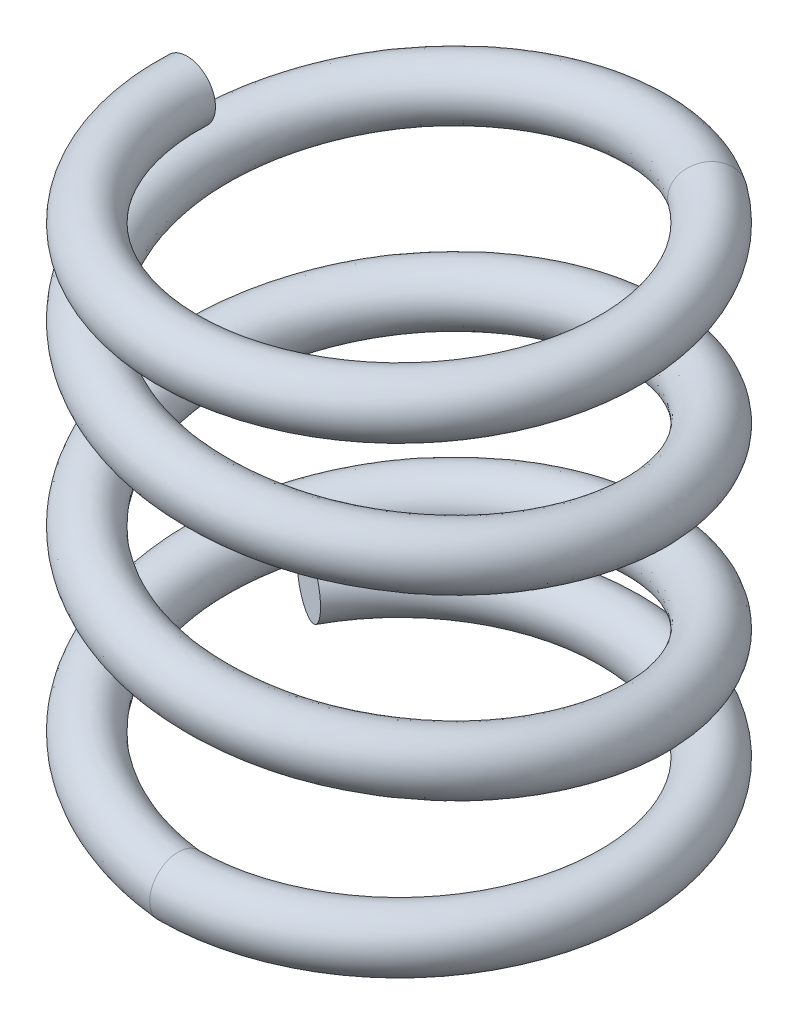
ISO-10303-21;
HEADER;
FILE_DESCRIPTION(('STEP AP214'),'2;1');
FILE_NAME('part.step','',(''),(''),'','','');
FILE_SCHEMA(('AUTOMOTIVE_DESIGN { 1 0 10303 214 1 1 1 1 }'));
ENDSEC;
DATA;
#1=APPLICATION_CONTEXT('core data for automotive mechanical design processes');
#2=APPLICATION_PROTOCOL_DEFINITION('international standard','automotive_design',2000,#1);
#3=PRODUCT_CONTEXT('',#1,'mechanical');
#4=PRODUCT('Part','Part','',(#3));
#5=PRODUCT_RELATED_PRODUCT_CATEGORY('part','',(#4));
#6=PRODUCT_DEFINITION_FORMATION('','',#4);
#7=PRODUCT_DEFINITION_CONTEXT('part definition',#1,'design');
#8=PRODUCT_DEFINITION('design','',#6,#7);
#9=PRODUCT_DEFINITION_SHAPE('','',#8);
#10=(LENGTH_UNIT() NAMED_UNIT(*) SI_UNIT(.MILLI.,.METRE.));
#11=(NAMED_UNIT(*) PLANE_ANGLE_UNIT() SI_UNIT($,.RADIAN.));
#12=(NAMED_UNIT(*) SI_UNIT($,.STERADIAN.) SOLID_ANGLE_UNIT());
#13=UNCERTAINTY_MEASURE_WITH_UNIT(LENGTH_MEASURE(1.E-05),#10,'distance_accuracy_value','');
#14=(GEOMETRIC_REPRESENTATION_CONTEXT(3) GLOBAL_UNCERTAINTY_ASSIGNED_CONTEXT((#13)) GLOBAL_UNIT_ASSIGNED_CONTEXT((#10,
#11,#12)) REPRESENTATION_CONTEXT('',''));
#15=CARTESIAN_POINT('',(0.,0.,0.));
#16=DIRECTION('',(0.,0.,1.));
#17=DIRECTION('',(1.,0.,0.));
#18=AXIS2_PLACEMENT_3D('',#15,#16,#17);
#19=CARTESIAN_POINT('',(0.,0.,2.7));
#20=CARTESIAN_POINT('',(-0.877283179828847,0.125,2.7));
#21=CARTESIAN_POINT('',(-1.58702018118968,0.25,2.18434588481236));
#22=CARTESIAN_POINT('',(-2.29675718255051,0.375,1.66869176962472));
#23=CARTESIAN_POINT('',(-2.56785259399691,0.5,0.834345884812358));
#24=CARTESIAN_POINT('',(-2.83894800544332,0.625,0.));
#25=CARTESIAN_POINT('',(-2.56785259399691,0.75,-0.834345884812358));
#26=CARTESIAN_POINT('',(-2.29675718255051,0.875,-1.66869176962472));
#27=CARTESIAN_POINT('',(-1.58702018118968,1.,-2.18434588481236));
#28=CARTESIAN_POINT('',(-0.877283179828847,1.125,-2.7));
#29=CARTESIAN_POINT('',(0.,1.25,-2.7));
#30=CARTESIAN_POINT('',(0.877283179828847,1.375,-2.7));
#31=CARTESIAN_POINT('',(1.58702018118968,1.5,-2.18434588481236));
#32=CARTESIAN_POINT('',(2.29675718255051,1.625,-1.66869176962472));
#33=CARTESIAN_POINT('',(2.56785259399691,1.75,-0.834345884812358));
#34=CARTESIAN_POINT('',(2.83894800544332,1.875,0.));
#35=CARTESIAN_POINT('',(2.56785259399691,2.,0.834345884812357));
#36=CARTESIAN_POINT('',(2.29675718255051,2.125,1.66869176962472));
#37=CARTESIAN_POINT('',(1.58702018118968,2.25,2.18434588481236));
#38=CARTESIAN_POINT('',(0.877283179828848,2.375,2.7));
#39=CARTESIAN_POINT('',(0.,2.5,2.7));
#40=CARTESIAN_POINT('',(-0.877283179828847,2.625,2.7));
#41=CARTESIAN_POINT('',(-1.58702018118968,2.75,2.18434588481236));
#42=CARTESIAN_POINT('',(-2.29675718255051,2.875,1.66869176962472));
#43=CARTESIAN_POINT('',(-2.56785259399691,3.,0.834345884812358));
#44=CARTESIAN_POINT('',(-2.83894800544332,3.125,0.));
#45=CARTESIAN_POINT('',(-2.56785259399691,3.25,-0.834345884812358));
#46=CARTESIAN_POINT('',(-2.29675718255051,3.375,-1.66869176962472));
#47=CARTESIAN_POINT('',(-1.58702018118968,3.5,-2.18434588481236));
#48=CARTESIAN_POINT('',(-0.877283179828847,3.625,-2.7));
#49=CARTESIAN_POINT('',(0.,3.75,-2.7));
#50=CARTESIAN_POINT('',(0.877283179828847,3.875,-2.7));
#51=CARTESIAN_POINT('',(1.58702018118968,4.,-2.18434588481236));
#52=CARTESIAN_POINT('',(2.29675718255051,4.125,-1.66869176962472));
#53=CARTESIAN_POINT('',(2.56785259399691,4.25,-0.834345884812358));
#54=CARTESIAN_POINT('',(2.83894800544332,4.375,0.));
#55=CARTESIAN_POINT('',(2.56785259399691,4.5,0.834345884812357));
#56=CARTESIAN_POINT('',(2.29675718255051,4.625,1.66869176962472));
#57=CARTESIAN_POINT('',(1.58702018118968,4.75,2.18434588481236));
#58=CARTESIAN_POINT('',(0.877283179828848,4.875,2.7));
#59=CARTESIAN_POINT('',(0.,5.,2.7));
#60=CARTESIAN_POINT('',(-0.877283179828847,5.125,2.7));
#61=CARTESIAN_POINT('',(-1.58702018118968,5.25,2.18434588481236));
#62=CARTESIAN_POINT('',(-2.29675718255051,5.375,1.66869176962472));
#63=CARTESIAN_POINT('',(-2.56785259399691,5.5,0.834345884812358));
#64=CARTESIAN_POINT('',(-2.83894800544332,5.625,0.));
#65=CARTESIAN_POINT('',(-2.56785259399691,5.75,-0.834345884812358));
#66=CARTESIAN_POINT('',(-2.29675718255051,5.875,-1.66869176962472));
#67=CARTESIAN_POINT('',(-1.58702018118968,6.,-2.18434588481236));
#68=CARTESIAN_POINT('',(-0.877283179828847,6.125,-2.7));
#69=CARTESIAN_POINT('',(0.,6.25,-2.7));
#70=CARTESIAN_POINT('',(0.877283179828847,6.375,-2.7));
#71=CARTESIAN_POINT('',(1.58702018118968,6.5,-2.18434588481236));
#72=CARTESIAN_POINT('',(0.,0.800000000000001,2.7));
#73=CARTESIAN_POINT('',(-0.877283179828847,0.925000000000001,2.7));
#74=CARTESIAN_POINT('',(-1.58702018118968,1.05,2.18434588481236));
#75=CARTESIAN_POINT('',(-2.29675718255051,1.175,1.66869176962472));
#76=CARTESIAN_POINT('',(-2.56785259399691,1.3,0.834345884812358));
#77=CARTESIAN_POINT('',(-2.83894800544332,1.425,0.));
#78=CARTESIAN_POINT('',(-2.56785259399691,1.55,-0.834345884812358));
#79=CARTESIAN_POINT('',(-2.29675718255051,1.675,-1.66869176962472));
#80=CARTESIAN_POINT('',(-1.58702018118968,1.8,-2.18434588481236));
#81=CARTESIAN_POINT('',(-0.877283179828847,1.925,-2.7));
#82=CARTESIAN_POINT('',(0.,2.05,-2.7));
#83=CARTESIAN_POINT('',(0.877283179828847,2.175,-2.7));
#84=CARTESIAN_POINT('',(1.58702018118968,2.3,-2.18434588481236));
#85=CARTESIAN_POINT('',(2.29675718255051,2.425,-1.66869176962472));
#86=CARTESIAN_POINT('',(2.56785259399691,2.55,-0.834345884812358));
#87=CARTESIAN_POINT('',(2.83894800544332,2.675,0.));
#88=CARTESIAN_POINT('',(2.56785259399691,2.8,0.834345884812357));
#89=CARTESIAN_POINT('',(2.29675718255051,2.925,1.66869176962472));
#90=CARTESIAN_POINT('',(1.58702018118968,3.05,2.18434588481236));
#91=CARTESIAN_POINT('',(0.877283179828848,3.175,2.7));
#92=CARTESIAN_POINT('',(0.,3.3,2.7));
#93=CARTESIAN_POINT('',(-0.877283179828847,3.425,2.7));
#94=CARTESIAN_POINT('',(-1.58702018118968,3.55,2.18434588481236));
#95=CARTESIAN_POINT('',(-2.29675718255051,3.675,1.66869176962472));
#96=CARTESIAN_POINT('',(-2.56785259399691,3.8,0.834345884812358));
#97=CARTESIAN_POINT('',(-2.83894800544332,3.925,0.));
#98=CARTESIAN_POINT('',(-2.56785259399691,4.05,-0.834345884812358));
#99=CARTESIAN_POINT('',(-2.29675718255051,4.175,-1.66869176962472));
#100=CARTESIAN_POINT('',(-1.58702018118968,4.3,-2.18434588481236));
#101=CARTESIAN_POINT('',(-0.877283179828847,4.425,-2.7));
#102=CARTESIAN_POINT('',(0.,4.55,-2.7));
#103=CARTESIAN_POINT('',(0.877283179828847,4.675,-2.7));
#104=CARTESIAN_POINT('',(1.58702018118968,4.8,-2.18434588481236));
#105=CARTESIAN_POINT('',(2.29675718255051,4.925,-1.66869176962472));
#106=CARTESIAN_POINT('',(2.56785259399691,5.05,-0.834345884812358));
#107=CARTESIAN_POINT('',(2.83894800544332,5.175,0.));
#108=CARTESIAN_POINT('',(2.56785259399691,5.3,0.834345884812357));
#109=CARTESIAN_POINT('',(2.29675718255051,5.425,1.66869176962472));
#110=CARTESIAN_POINT('',(1.58702018118968,5.55,2.18434588481236));
#111=CARTESIAN_POINT('',(0.877283179828848,5.675,2.7));
#112=CARTESIAN_POINT('',(0.,5.8,2.7));
#113=CARTESIAN_POINT('',(-0.877283179828847,5.925,2.7));
#114=CARTESIAN_POINT('',(-1.58702018118968,6.05,2.18434588481236));
#115=CARTESIAN_POINT('',(-2.29675718255051,6.175,1.66869176962472));
#116=CARTESIAN_POINT('',(-2.56785259399691,6.3,0.834345884812358));
#117=CARTESIAN_POINT('',(-2.83894800544332,6.425,0.));
#118=CARTESIAN_POINT('',(-2.56785259399691,6.55,-0.834345884812358));
#119=CARTESIAN_POINT('',(-2.29675718255051,6.675,-1.66869176962472));
#120=CARTESIAN_POINT('',(-1.58702018118968,6.8,-2.18434588481236));
#121=CARTESIAN_POINT('',(-0.877283179828847,6.925,-2.7));
#122=CARTESIAN_POINT('',(0.,7.05,-2.7));
#123=CARTESIAN_POINT('',(0.877283179828847,7.175,-2.7));
#124=CARTESIAN_POINT('',(1.58702018118968,7.3,-2.18434588481236));
#125=CARTESIAN_POINT('',(0.,0.800000000000001,3.5));
#126=CARTESIAN_POINT('',(-1.13721893681517,0.925000000000001,3.5));
#127=CARTESIAN_POINT('',(-2.05724838302366,1.05,2.83155948031232));
#128=CARTESIAN_POINT('',(-2.97727782923214,1.175,2.16311896062463));
#129=CARTESIAN_POINT('',(-3.32869780703304,1.3,1.08155948031232));
#130=CARTESIAN_POINT('',(-3.68011778483394,1.425,0.));
#131=CARTESIAN_POINT('',(-3.32869780703304,1.55,-1.08155948031232));
#132=CARTESIAN_POINT('',(-2.97727782923214,1.675,-2.16311896062463));
#133=CARTESIAN_POINT('',(-2.05724838302366,1.8,-2.83155948031232));
#134=CARTESIAN_POINT('',(-1.13721893681517,1.925,-3.5));
#135=CARTESIAN_POINT('',(0.,2.05,-3.5));
#136=CARTESIAN_POINT('',(1.13721893681517,2.175,-3.5));
#137=CARTESIAN_POINT('',(2.05724838302366,2.3,-2.83155948031232));
#138=CARTESIAN_POINT('',(2.97727782923214,2.425,-2.16311896062463));
#139=CARTESIAN_POINT('',(3.32869780703304,2.55,-1.08155948031232));
#140=CARTESIAN_POINT('',(3.68011778483394,2.675,0.));
#141=CARTESIAN_POINT('',(3.32869780703304,2.8,1.08155948031232));
#142=CARTESIAN_POINT('',(2.97727782923214,2.925,2.16311896062463));
#143=CARTESIAN_POINT('',(2.05724838302366,3.05,2.83155948031232));
#144=CARTESIAN_POINT('',(1.13721893681517,3.175,3.5));
#145=CARTESIAN_POINT('',(0.,3.3,3.5));
#146=CARTESIAN_POINT('',(-1.13721893681517,3.425,3.5));
#147=CARTESIAN_POINT('',(-2.05724838302366,3.55,2.83155948031232));
#148=CARTESIAN_POINT('',(-2.97727782923214,3.675,2.16311896062463));
#149=CARTESIAN_POINT('',(-3.32869780703304,3.8,1.08155948031232));
#150=CARTESIAN_POINT('',(-3.68011778483394,3.925,0.));
#151=CARTESIAN_POINT('',(-3.32869780703304,4.05,-1.08155948031232));
#152=CARTESIAN_POINT('',(-2.97727782923214,4.175,-2.16311896062463));
#153=CARTESIAN_POINT('',(-2.05724838302366,4.3,-2.83155948031232));
#154=CARTESIAN_POINT('',(-1.13721893681517,4.425,-3.5));
#155=CARTESIAN_POINT('',(0.,4.55,-3.5));
#156=CARTESIAN_POINT('',(1.13721893681517,4.675,-3.5));
#157=CARTESIAN_POINT('',(2.05724838302366,4.8,-2.83155948031232));
#158=CARTESIAN_POINT('',(2.97727782923214,4.925,-2.16311896062463));
#159=CARTESIAN_POINT('',(3.32869780703304,5.05,-1.08155948031232));
#160=CARTESIAN_POINT('',(3.68011778483394,5.175,0.));
#161=CARTESIAN_POINT('',(3.32869780703304,5.3,1.08155948031232));
#162=CARTESIAN_POINT('',(2.97727782923214,5.425,2.16311896062463));
#163=CARTESIAN_POINT('',(2.05724838302366,5.55,2.83155948031232));
#164=CARTESIAN_POINT('',(1.13721893681517,5.675,3.5));
#165=CARTESIAN_POINT('',(0.,5.8,3.5));
#166=CARTESIAN_POINT('',(-1.13721893681517,5.925,3.5));
#167=CARTESIAN_POINT('',(-2.05724838302366,6.05,2.83155948031232));
#168=CARTESIAN_POINT('',(-2.97727782923214,6.175,2.16311896062463));
#169=CARTESIAN_POINT('',(-3.32869780703304,6.3,1.08155948031232));
#170=CARTESIAN_POINT('',(-3.68011778483394,6.425,0.));
#171=CARTESIAN_POINT('',(-3.32869780703304,6.55,-1.08155948031232));
#172=CARTESIAN_POINT('',(-2.97727782923214,6.675,-2.16311896062463));
#173=CARTESIAN_POINT('',(-2.05724838302366,6.8,-2.83155948031232));
#174=CARTESIAN_POINT('',(-1.13721893681517,6.925,-3.5));
#175=CARTESIAN_POINT('',(0.,7.05,-3.5));
#176=CARTESIAN_POINT('',(1.13721893681517,7.175,-3.5));
#177=CARTESIAN_POINT('',(2.05724838302366,7.3,-2.83155948031232));
#178=CARTESIAN_POINT('',(0.,0.,3.5));
#179=CARTESIAN_POINT('',(-1.13721893681517,0.125,3.5));
#180=CARTESIAN_POINT('',(-2.05724838302366,0.25,2.83155948031232));
#181=CARTESIAN_POINT('',(-2.97727782923214,0.375,2.16311896062463));
#182=CARTESIAN_POINT('',(-3.32869780703304,0.5,1.08155948031232));
#183=CARTESIAN_POINT('',(-3.68011778483394,0.625,0.));
#184=CARTESIAN_POINT('',(-3.32869780703304,0.75,-1.08155948031232));
#185=CARTESIAN_POINT('',(-2.97727782923214,0.875,-2.16311896062463));
#186=CARTESIAN_POINT('',(-2.05724838302366,1.,-2.83155948031232));
#187=CARTESIAN_POINT('',(-1.13721893681517,1.125,-3.5));
#188=CARTESIAN_POINT('',(0.,1.25,-3.5));
#189=CARTESIAN_POINT('',(1.13721893681517,1.375,-3.5));
#190=CARTESIAN_POINT('',(2.05724838302366,1.5,-2.83155948031232));
#191=CARTESIAN_POINT('',(2.97727782923214,1.625,-2.16311896062463));
#192=CARTESIAN_POINT('',(3.32869780703304,1.75,-1.08155948031232));
#193=CARTESIAN_POINT('',(3.68011778483394,1.875,0.));
#194=CARTESIAN_POINT('',(3.32869780703304,2.,1.08155948031232));
#195=CARTESIAN_POINT('',(2.97727782923214,2.125,2.16311896062463));
#196=CARTESIAN_POINT('',(2.05724838302366,2.25,2.83155948031232));
#197=CARTESIAN_POINT('',(1.13721893681517,2.375,3.5));
#198=CARTESIAN_POINT('',(0.,2.5,3.5));
#199=CARTESIAN_POINT('',(-1.13721893681517,2.625,3.5));
#200=CARTESIAN_POINT('',(-2.05724838302366,2.75,2.83155948031232));
#201=CARTESIAN_POINT('',(-2.97727782923214,2.875,2.16311896062463));
#202=CARTESIAN_POINT('',(-3.32869780703304,3.,1.08155948031232));
#203=CARTESIAN_POINT('',(-3.68011778483394,3.125,0.));
#204=CARTESIAN_POINT('',(-3.32869780703304,3.25,-1.08155948031232));
#205=CARTESIAN_POINT('',(-2.97727782923214,3.375,-2.16311896062463));
#206=CARTESIAN_POINT('',(-2.05724838302366,3.5,-2.83155948031232));
#207=CARTESIAN_POINT('',(-1.13721893681517,3.625,-3.5));
#208=CARTESIAN_POINT('',(0.,3.75,-3.5));
#209=CARTESIAN_POINT('',(1.13721893681517,3.875,-3.5));
#210=CARTESIAN_POINT('',(2.05724838302366,4.,-2.83155948031232));
#211=CARTESIAN_POINT('',(2.97727782923214,4.125,-2.16311896062463));
#212=CARTESIAN_POINT('',(3.32869780703304,4.25,-1.08155948031232));
#213=CARTESIAN_POINT('',(3.68011778483394,4.375,0.));
#214=CARTESIAN_POINT('',(3.32869780703304,4.5,1.08155948031232));
#215=CARTESIAN_POINT('',(2.97727782923214,4.625,2.16311896062463));
#216=CARTESIAN_POINT('',(2.05724838302366,4.75,2.83155948031232));
#217=CARTESIAN_POINT('',(1.13721893681517,4.875,3.5));
#218=CARTESIAN_POINT('',(0.,5.,3.5));
#219=CARTESIAN_POINT('',(-1.13721893681517,5.125,3.5));
#220=CARTESIAN_POINT('',(-2.05724838302366,5.25,2.83155948031232));
#221=CARTESIAN_POINT('',(-2.97727782923214,5.375,2.16311896062463));
#222=CARTESIAN_POINT('',(-3.32869780703304,5.5,1.08155948031232));
#223=CARTESIAN_POINT('',(-3.68011778483394,5.625,0.));
#224=CARTESIAN_POINT('',(-3.32869780703304,5.75,-1.08155948031232));
#225=CARTESIAN_POINT('',(-2.97727782923214,5.875,-2.16311896062463));
#226=CARTESIAN_POINT('',(-2.05724838302366,6.,-2.83155948031232));
#227=CARTESIAN_POINT('',(-1.13721893681517,6.125,-3.5));
#228=CARTESIAN_POINT('',(0.,6.25,-3.5));
#229=CARTESIAN_POINT('',(1.13721893681517,6.375,-3.5));
#230=CARTESIAN_POINT('',(2.05724838302366,6.5,-2.83155948031232));
#231=CARTESIAN_POINT('',(0.,-0.800000000000001,3.5));
#232=CARTESIAN_POINT('',(-1.13721893681517,-0.675000000000001,3.5));
#233=CARTESIAN_POINT('',(-2.05724838302366,-0.550000000000001,2.83155948031232));
#234=CARTESIAN_POINT('',(-2.97727782923214,-0.425000000000001,2.16311896062463));
#235=CARTESIAN_POINT('',(-3.32869780703304,-0.300000000000001,1.08155948031232));
#236=CARTESIAN_POINT('',(-3.68011778483394,-0.175000000000001,0.));
#237=CARTESIAN_POINT('',(-3.32869780703304,-0.0500000000000008,-1.08155948031232));
#238=CARTESIAN_POINT('',(-2.97727782923214,0.0749999999999992,-2.16311896062463));
#239=CARTESIAN_POINT('',(-2.05724838302366,0.199999999999999,-2.83155948031232));
#240=CARTESIAN_POINT('',(-1.13721893681517,0.324999999999999,-3.5));
#241=CARTESIAN_POINT('',(0.,0.449999999999999,-3.5));
#242=CARTESIAN_POINT('',(1.13721893681517,0.574999999999999,-3.5));
#243=CARTESIAN_POINT('',(2.05724838302366,0.699999999999999,-2.83155948031232));
#244=CARTESIAN_POINT('',(2.97727782923214,0.824999999999999,-2.16311896062463));
#245=CARTESIAN_POINT('',(3.32869780703304,0.949999999999999,-1.08155948031232));
#246=CARTESIAN_POINT('',(3.68011778483394,1.075,0.));
#247=CARTESIAN_POINT('',(3.32869780703304,1.2,1.08155948031232));
#248=CARTESIAN_POINT('',(2.97727782923214,1.325,2.16311896062463));
#249=CARTESIAN_POINT('',(2.05724838302366,1.45,2.83155948031232));
#250=CARTESIAN_POINT('',(1.13721893681517,1.575,3.5));
#251=CARTESIAN_POINT('',(0.,1.7,3.5));
#252=CARTESIAN_POINT('',(-1.13721893681517,1.825,3.5));
#253=CARTESIAN_POINT('',(-2.05724838302366,1.95,2.83155948031232));
#254=CARTESIAN_POINT('',(-2.97727782923214,2.075,2.16311896062463));
#255=CARTESIAN_POINT('',(-3.32869780703304,2.2,1.08155948031232));
#256=CARTESIAN_POINT('',(-3.68011778483394,2.325,0.));
#257=CARTESIAN_POINT('',(-3.32869780703304,2.45,-1.08155948031232));
#258=CARTESIAN_POINT('',(-2.97727782923214,2.575,-2.16311896062463));
#259=CARTESIAN_POINT('',(-2.05724838302366,2.7,-2.83155948031232));
#260=CARTESIAN_POINT('',(-1.13721893681517,2.825,-3.5));
#261=CARTESIAN_POINT('',(0.,2.95,-3.5));
#262=CARTESIAN_POINT('',(1.13721893681517,3.075,-3.5));
#263=CARTESIAN_POINT('',(2.05724838302366,3.2,-2.83155948031232));
#264=CARTESIAN_POINT('',(2.97727782923214,3.325,-2.16311896062463));
#265=CARTESIAN_POINT('',(3.32869780703304,3.45,-1.08155948031232));
#266=CARTESIAN_POINT('',(3.68011778483394,3.575,0.));
#267=CARTESIAN_POINT('',(3.32869780703304,3.7,1.08155948031232));
#268=CARTESIAN_POINT('',(2.97727782923214,3.825,2.16311896062463));
#269=CARTESIAN_POINT('',(2.05724838302366,3.95,2.83155948031232));
#270=CARTESIAN_POINT('',(1.13721893681517,4.075,3.5));
#271=CARTESIAN_POINT('',(0.,4.2,3.5));
#272=CARTESIAN_POINT('',(-1.13721893681517,4.325,3.5));
#273=CARTESIAN_POINT('',(-2.05724838302366,4.45,2.83155948031232));
#274=CARTESIAN_POINT('',(-2.97727782923214,4.575,2.16311896062463));
#275=CARTESIAN_POINT('',(-3.32869780703304,4.7,1.08155948031232));
#276=CARTESIAN_POINT('',(-3.68011778483394,4.825,0.));
#277=CARTESIAN_POINT('',(-3.32869780703304,4.95,-1.08155948031232));
#278=CARTESIAN_POINT('',(-2.97727782923214,5.075,-2.16311896062463));
#279=CARTESIAN_POINT('',(-2.05724838302366,5.2,-2.83155948031232));
#280=CARTESIAN_POINT('',(-1.13721893681517,5.325,-3.5));
#281=CARTESIAN_POINT('',(0.,5.45,-3.5));
#282=CARTESIAN_POINT('',(1.13721893681517,5.575,-3.5));
#283=CARTESIAN_POINT('',(2.05724838302366,5.7,-2.83155948031232));
#284=CARTESIAN_POINT('',(0.,-0.800000000000001,2.7));
#285=CARTESIAN_POINT('',(-0.877283179828847,-0.675000000000001,2.7));
#286=CARTESIAN_POINT('',(-1.58702018118968,-0.550000000000001,2.18434588481236));
#287=CARTESIAN_POINT('',(-2.29675718255051,-0.425000000000001,1.66869176962472));
#288=CARTESIAN_POINT('',(-2.56785259399691,-0.300000000000001,0.834345884812358));
#289=CARTESIAN_POINT('',(-2.83894800544332,-0.175000000000001,0.));
#290=CARTESIAN_POINT('',(-2.56785259399691,-0.0500000000000008,-0.834345884812358));
#291=CARTESIAN_POINT('',(-2.29675718255051,0.0749999999999992,-1.66869176962472));
#292=CARTESIAN_POINT('',(-1.58702018118968,0.199999999999999,-2.18434588481236));
#293=CARTESIAN_POINT('',(-0.877283179828847,0.324999999999999,-2.7));
#294=CARTESIAN_POINT('',(0.,0.449999999999999,-2.7));
#295=CARTESIAN_POINT('',(0.877283179828847,0.574999999999999,-2.7));
#296=CARTESIAN_POINT('',(1.58702018118968,0.699999999999999,-2.18434588481236));
#297=CARTESIAN_POINT('',(2.29675718255051,0.824999999999999,-1.66869176962472));
#298=CARTESIAN_POINT('',(2.56785259399691,0.949999999999999,-0.834345884812358));
#299=CARTESIAN_POINT('',(2.83894800544332,1.075,0.));
#300=CARTESIAN_POINT('',(2.56785259399691,1.2,0.834345884812357));
#301=CARTESIAN_POINT('',(2.29675718255051,1.325,1.66869176962472));
#302=CARTESIAN_POINT('',(1.58702018118968,1.45,2.18434588481236));
#303=CARTESIAN_POINT('',(0.877283179828848,1.575,2.7));
#304=CARTESIAN_POINT('',(0.,1.7,2.7));
#305=CARTESIAN_POINT('',(-0.877283179828847,1.825,2.7));
#306=CARTESIAN_POINT('',(-1.58702018118968,1.95,2.18434588481236));
#307=CARTESIAN_POINT('',(-2.29675718255051,2.075,1.66869176962472));
#308=CARTESIAN_POINT('',(-2.56785259399691,2.2,0.834345884812358));
#309=CARTESIAN_POINT('',(-2.83894800544332,2.325,0.));
#310=CARTESIAN_POINT('',(-2.56785259399691,2.45,-0.834345884812358));
#311=CARTESIAN_POINT('',(-2.29675718255051,2.575,-1.66869176962472));
#312=CARTESIAN_POINT('',(-1.58702018118968,2.7,-2.18434588481236));
#313=CARTESIAN_POINT('',(-0.877283179828847,2.825,-2.7));
#314=CARTESIAN_POINT('',(0.,2.95,-2.7));
#315=CARTESIAN_POINT('',(0.877283179828847,3.075,-2.7));
#316=CARTESIAN_POINT('',(1.58702018118968,3.2,-2.18434588481236));
#317=CARTESIAN_POINT('',(2.29675718255051,3.325,-1.66869176962472));
#318=CARTESIAN_POINT('',(2.56785259399691,3.45,-0.834345884812358));
#319=CARTESIAN_POINT('',(2.83894800544332,3.575,0.));
#320=CARTESIAN_POINT('',(2.56785259399691,3.7,0.834345884812357));
#321=CARTESIAN_POINT('',(2.29675718255051,3.825,1.66869176962472));
#322=CARTESIAN_POINT('',(1.58702018118968,3.95,2.18434588481236));
#323=CARTESIAN_POINT('',(0.877283179828848,4.075,2.7));
#324=CARTESIAN_POINT('',(0.,4.2,2.7));
#325=CARTESIAN_POINT('',(-0.877283179828847,4.325,2.7));
#326=CARTESIAN_POINT('',(-1.58702018118968,4.45,2.18434588481236));
#327=CARTESIAN_POINT('',(-2.29675718255051,4.575,1.66869176962472));
#328=CARTESIAN_POINT('',(-2.56785259399691,4.7,0.834345884812358));
#329=CARTESIAN_POINT('',(-2.83894800544332,4.825,0.));
#330=CARTESIAN_POINT('',(-2.56785259399691,4.95,-0.834345884812358));
#331=CARTESIAN_POINT('',(-2.29675718255051,5.075,-1.66869176962472));
#332=CARTESIAN_POINT('',(-1.58702018118968,5.2,-2.18434588481236));
#333=CARTESIAN_POINT('',(-0.877283179828847,5.325,-2.7));
#334=CARTESIAN_POINT('',(0.,5.45,-2.7));
#335=CARTESIAN_POINT('',(0.877283179828847,5.575,-2.7));
#336=CARTESIAN_POINT('',(1.58702018118968,5.7,-2.18434588481236));
#337=CARTESIAN_POINT('',(0.,0.,2.7));
#338=CARTESIAN_POINT('',(-0.877283179828847,0.125,2.7));
#339=CARTESIAN_POINT('',(-1.58702018118968,0.25,2.18434588481236));
#340=CARTESIAN_POINT('',(-2.29675718255051,0.375,1.66869176962472));
#341=CARTESIAN_POINT('',(-2.56785259399691,0.5,0.834345884812358));
#342=CARTESIAN_POINT('',(-2.83894800544332,0.625,0.));
#343=CARTESIAN_POINT('',(-2.56785259399691,0.75,-0.834345884812358));
#344=CARTESIAN_POINT('',(-2.29675718255051,0.875,-1.66869176962472));
#345=CARTESIAN_POINT('',(-1.58702018118968,1.,-2.18434588481236));
#346=CARTESIAN_POINT('',(-0.877283179828847,1.125,-2.7));
#347=CARTESIAN_POINT('',(0.,1.25,-2.7));
#348=CARTESIAN_POINT('',(0.877283179828847,1.375,-2.7));
#349=CARTESIAN_POINT('',(1.58702018118968,1.5,-2.18434588481236));
#350=CARTESIAN_POINT('',(2.29675718255051,1.625,-1.66869176962472));
#351=CARTESIAN_POINT('',(2.56785259399691,1.75,-0.834345884812358));
#352=CARTESIAN_POINT('',(2.83894800544332,1.875,0.));
#353=CARTESIAN_POINT('',(2.56785259399691,2.,0.834345884812357));
#354=CARTESIAN_POINT('',(2.29675718255051,2.125,1.66869176962472));
#355=CARTESIAN_POINT('',(1.58702018118968,2.25,2.18434588481236));
#356=CARTESIAN_POINT('',(0.877283179828848,2.375,2.7));
#357=CARTESIAN_POINT('',(0.,2.5,2.7));
#358=CARTESIAN_POINT('',(-0.877283179828847,2.625,2.7));
#359=CARTESIAN_POINT('',(-1.58702018118968,2.75,2.18434588481236));
#360=CARTESIAN_POINT('',(-2.29675718255051,2.875,1.66869176962472));
#361=CARTESIAN_POINT('',(-2.56785259399691,3.,0.834345884812358));
#362=CARTESIAN_POINT('',(-2.83894800544332,3.125,0.));
#363=CARTESIAN_POINT('',(-2.56785259399691,3.25,-0.834345884812358));
#364=CARTESIAN_POINT('',(-2.29675718255051,3.375,-1.66869176962472));
#365=CARTESIAN_POINT('',(-1.58702018118968,3.5,-2.18434588481236));
#366=CARTESIAN_POINT('',(-0.877283179828847,3.625,-2.7));
#367=CARTESIAN_POINT('',(0.,3.75,-2.7));
#368=CARTESIAN_POINT('',(0.877283179828847,3.875,-2.7));
#369=CARTESIAN_POINT('',(1.58702018118968,4.,-2.18434588481236));
#370=CARTESIAN_POINT('',(2.29675718255051,4.125,-1.66869176962472));
#371=CARTESIAN_POINT('',(2.56785259399691,4.25,-0.834345884812358));
#372=CARTESIAN_POINT('',(2.83894800544332,4.375,0.));
#373=CARTESIAN_POINT('',(2.56785259399691,4.5,0.834345884812357));
#374=CARTESIAN_POINT('',(2.29675718255051,4.625,1.66869176962472));
#375=CARTESIAN_POINT('',(1.58702018118968,4.75,2.18434588481236));
#376=CARTESIAN_POINT('',(0.877283179828848,4.875,2.7));
#377=CARTESIAN_POINT('',(0.,5.,2.7));
#378=CARTESIAN_POINT('',(-0.877283179828847,5.125,2.7));
#379=CARTESIAN_POINT('',(-1.58702018118968,5.25,2.18434588481236));
#380=CARTESIAN_POINT('',(-2.29675718255051,5.375,1.66869176962472));
#381=CARTESIAN_POINT('',(-2.56785259399691,5.5,0.834345884812358));
#382=CARTESIAN_POINT('',(-2.83894800544332,5.625,0.));
#383=CARTESIAN_POINT('',(-2.56785259399691,5.75,-0.834345884812358));
#384=CARTESIAN_POINT('',(-2.29675718255051,5.875,-1.66869176962472));
#385=CARTESIAN_POINT('',(-1.58702018118968,6.,-2.18434588481236));
#386=CARTESIAN_POINT('',(-0.877283179828847,6.125,-2.7));
#387=CARTESIAN_POINT('',(0.,6.25,-2.7));
#388=CARTESIAN_POINT('',(0.877283179828847,6.375,-2.7));
#389=CARTESIAN_POINT('',(1.58702018118968,6.5,-2.18434588481236));
#390=(BOUNDED_SURFACE() B_SPLINE_SURFACE(3,2,((#19,#20,#21,#22,#23,#24,#25,#26,#27,#28,#29,#30,
#31,#32,#33,#34,#35,#36,#37,#38,#39,#40,#41,#42,#43,#44,#45,#46,#47,#48,#49,#50,#51,#52,#53,#54,
#55,#56,#57,#58,#59,#60,#61,#62,#63,#64,#65,#66,#67,#68,#69,#70,#71),(#72,#73,#74,#75,#76,#77,
#78,#79,#80,#81,#82,#83,#84,#85,#86,#87,#88,#89,#90,#91,#92,#93,#94,#95,#96,#97,#98,#99,#100,
#101,#102,#103,#104,#105,#106,#107,#108,#109,#110,#111,#112,#113,#114,#115,#116,#117,#118,#119,
#120,#121,#122,#123,#124),(#125,#126,#127,#128,#129,#130,#131,#132,#133,#134,#135,#136,#137,
#138,#139,#140,#141,#142,#143,#144,#145,#146,#147,#148,#149,#150,#151,#152,#153,#154,#155,#156,
#157,#158,#159,#160,#161,#162,#163,#164,#165,#166,#167,#168,#169,#170,#171,#172,#173,#174,#175,
#176,#177),(#178,#179,#180,#181,#182,#183,#184,#185,#186,#187,#188,#189,#190,#191,#192,#193,
#194,#195,#196,#197,#198,#199,#200,#201,#202,#203,#204,#205,#206,#207,#208,#209,#210,#211,#212,
#213,#214,#215,#216,#217,#218,#219,#220,#221,#222,#223,#224,#225,#226,#227,#228,#229,#230),
(#231,#232,#233,#234,#235,#236,#237,#238,#239,#240,#241,#242,#243,#244,#245,#246,#247,#248,#249,
#250,#251,#252,#253,#254,#255,#256,#257,#258,#259,#260,#261,#262,#263,#264,#265,#266,#267,#268,
#269,#270,#271,#272,#273,#274,#275,#276,#277,#278,#279,#280,#281,#282,#283),(#284,#285,#286,
#287,#288,#289,#290,#291,#292,#293,#294,#295,#296,#297,#298,#299,#300,#301,#302,#303,#304,#305,
#306,#307,#308,#309,#310,#311,#312,#313,#314,#315,#316,#317,#318,#319,#320,#321,#322,#323,#324,
#325,#326,#327,#328,#329,#330,#331,#332,#333,#334,#335,#336),(#337,#338,#339,#340,#341,#342,
#343,#344,#345,#346,#347,#348,#349,#350,#351,#352,#353,#354,#355,#356,#357,#358,#359,#360,#361,
#362,#363,#364,#365,#366,#367,#368,#369,#370,#371,#372,#373,#374,#375,#376,#377,#378,#379,#380,
#381,#382,#383,#384,#385,#386,#387,#388,#389)),.UNSPECIFIED.,.T.,.F.,
.F.) B_SPLINE_SURFACE_WITH_KNOTS((4,3,4),(3,2,2,2,2,2,2,2,2,2,2,2,2,2,2,2,2,2,2,2,2,2,2,2,2,2,
3),(0.,0.5,1.),(0.,0.0333333333333333,0.0666666666666667,0.1,0.133333333333333,
0.166666666666667,0.2,0.233333333333333,0.266666666666667,0.3,0.333333333333333,
0.366666666666667,0.4,0.433333333333333,0.466666666666667,0.5,0.533333333333333,
0.566666666666667,0.6,0.633333333333333,0.666666666666667,0.7,0.733333333333333,
0.766666666666667,0.8,0.833333333333333,0.866666666666667),
.UNSPECIFIED.) GEOMETRIC_REPRESENTATION_ITEM() RATIONAL_B_SPLINE_SURFACE(((1.,0.951056516295154,
1.,0.951056516295154,1.,0.951056516295154,1.,0.951056516295154,1.,0.951056516295154,1.,
0.951056516295154,1.,0.951056516295154,1.,0.951056516295154,1.,0.951056516295154,1.,
0.951056516295154,1.,0.951056516295154,1.,0.951056516295154,1.,0.951056516295154,1.,
0.951056516295154,1.,0.951056516295154,1.,0.951056516295154,1.,0.951056516295154,1.,
0.951056516295154,1.,0.951056516295154,1.,0.951056516295154,1.,0.951056516295154,1.,
0.951056516295154,1.,0.951056516295154,1.,0.951056516295154,1.,0.951056516295154,1.,
0.951056516295154,1.),(0.333333333333333,0.317018838765051,0.333333333333333,0.317018838765051,
0.333333333333333,0.317018838765051,0.333333333333333,0.317018838765051,0.333333333333333,
0.317018838765051,0.333333333333333,0.317018838765051,0.333333333333333,0.317018838765051,
0.333333333333333,0.317018838765051,0.333333333333333,0.317018838765051,0.333333333333333,
0.317018838765051,0.333333333333333,0.317018838765051,0.333333333333333,0.317018838765051,
0.333333333333333,0.317018838765051,0.333333333333333,0.317018838765051,0.333333333333333,
0.317018838765051,0.333333333333333,0.317018838765051,0.333333333333333,0.317018838765051,
0.333333333333333,0.317018838765051,0.333333333333333,0.317018838765051,0.333333333333333,
0.317018838765051,0.333333333333333,0.317018838765051,0.333333333333333,0.317018838765051,
0.333333333333333,0.317018838765051,0.333333333333333,0.317018838765051,0.333333333333333,
0.317018838765051,0.333333333333333,0.317018838765051,0.333333333333333),(0.333333333333333,
0.317018838765051,0.333333333333333,0.317018838765051,0.333333333333333,0.317018838765051,
0.333333333333333,0.317018838765051,0.333333333333333,0.317018838765051,0.333333333333333,
0.317018838765051,0.333333333333333,0.317018838765051,0.333333333333333,0.317018838765051,
0.333333333333333,0.317018838765051,0.333333333333333,0.317018838765051,0.333333333333333,
0.317018838765051,0.333333333333333,0.317018838765051,0.333333333333333,0.317018838765051,
0.333333333333333,0.317018838765051,0.333333333333333,0.317018838765051,0.333333333333333,
0.317018838765051,0.333333333333333,0.317018838765051,0.333333333333333,0.317018838765051,
0.333333333333333,0.317018838765051,0.333333333333333,0.317018838765051,0.333333333333333,
0.317018838765051,0.333333333333333,0.317018838765051,0.333333333333333,0.317018838765051,
0.333333333333333,0.317018838765051,0.333333333333333,0.317018838765051,0.333333333333333,
0.317018838765051,0.333333333333333),(1.,0.951056516295154,1.,0.951056516295154,1.,
0.951056516295154,1.,0.951056516295154,1.,0.951056516295154,1.,0.951056516295154,1.,
0.951056516295154,1.,0.951056516295154,1.,0.951056516295154,1.,0.951056516295154,1.,
0.951056516295154,1.,0.951056516295154,1.,0.951056516295154,1.,0.951056516295154,1.,
0.951056516295154,1.,0.951056516295154,1.,0.951056516295154,1.,0.951056516295154,1.,
0.951056516295154,1.,0.951056516295154,1.,0.951056516295154,1.,0.951056516295154,1.,
0.951056516295154,1.,0.951056516295154,1.,0.951056516295154,1.,0.951056516295154,1.),
(0.333333333333333,0.317018838765051,0.333333333333333,0.317018838765051,0.333333333333333,
0.317018838765051,0.333333333333333,0.317018838765051,0.333333333333333,0.317018838765051,
0.333333333333333,0.317018838765051,0.333333333333333,0.317018838765051,0.333333333333333,
0.317018838765051,0.333333333333333,0.317018838765051,0.333333333333333,0.317018838765051,
0.333333333333333,0.317018838765051,0.333333333333333,0.317018838765051,0.333333333333333,
0.317018838765051,0.333333333333333,0.317018838765051,0.333333333333333,0.317018838765051,
0.333333333333333,0.317018838765051,0.333333333333333,0.317018838765051,0.333333333333333,
0.317018838765051,0.333333333333333,0.317018838765051,0.333333333333333,0.317018838765051,
0.333333333333333,0.317018838765051,0.333333333333333,0.317018838765051,0.333333333333333,
0.317018838765051,0.333333333333333,0.317018838765051,0.333333333333333,0.317018838765051,
0.333333333333333,0.317018838765051,0.333333333333333),(0.333333333333333,0.317018838765051,
0.333333333333333,0.317018838765051,0.333333333333333,0.317018838765051,0.333333333333333,
0.317018838765051,0.333333333333333,0.317018838765051,0.333333333333333,0.317018838765051,
0.333333333333333,0.317018838765051,0.333333333333333,0.317018838765051,0.333333333333333,
0.317018838765051,0.333333333333333,0.317018838765051,0.333333333333333,0.317018838765051,
0.333333333333333,0.317018838765051,0.333333333333333,0.317018838765051,0.333333333333333,
0.317018838765051,0.333333333333333,0.317018838765051,0.333333333333333,0.317018838765051,
0.333333333333333,0.317018838765051,0.333333333333333,0.317018838765051,0.333333333333333,
0.317018838765051,0.333333333333333,0.317018838765051,0.333333333333333,0.317018838765051,
0.333333333333333,0.317018838765051,0.333333333333333,0.317018838765051,0.333333333333333,
0.317018838765051,0.333333333333333,0.317018838765051,0.333333333333333,0.317018838765051,
0.333333333333333),(1.,0.951056516295154,1.,0.951056516295154,1.,0.951056516295154,1.,
0.951056516295154,1.,0.951056516295154,1.,0.951056516295154,1.,0.951056516295154,1.,
0.951056516295154,1.,0.951056516295154,1.,0.951056516295154,1.,0.951056516295154,1.,
0.951056516295154,1.,0.951056516295154,1.,0.951056516295154,1.,0.951056516295154,1.,
0.951056516295154,1.,0.951056516295154,1.,0.951056516295154,1.,0.951056516295154,1.,
0.951056516295154,1.,0.951056516295154,1.,0.951056516295154,1.,0.951056516295154,1.,
0.951056516295154,1.,0.951056516295154,1.,0.951056516295154,1.))) REPRESENTATION_ITEM('') SURFACE());
#391=CARTESIAN_POINT('',(0.,0.,3.1));
#392=DIRECTION('',(1.,0.,0.));
#393=DIRECTION('',(0.,0.,-1.));
#394=AXIS2_PLACEMENT_3D('',#391,#392,#393);
#395=CIRCLE('',#394,0.400000000000001);
#396=CARTESIAN_POINT('',(0.,0.,3.5));
#397=VERTEX_POINT('',#396);
#398=EDGE_CURVE('E38',#397,#397,#395,.T.);
#399=CARTESIAN_POINT('',(1.82213428210667,6.5,-2.50795268256234));
#400=DIRECTION('',(0.809016994374948,0.,0.587785252292473));
#401=DIRECTION('',(-0.587785252292473,0.,0.809016994374947));
#402=AXIS2_PLACEMENT_3D('',#399,#400,#401);
#403=CIRCLE('',#402,0.400000000000001);
#404=CARTESIAN_POINT('',(2.05724838302366,6.5,-2.83155948031232));
#405=VERTEX_POINT('',#404);
#406=EDGE_CURVE('E10',#405,#405,#403,.T.);
#407=ORIENTED_EDGE('',*,*,#398,.F.);
#408=EDGE_LOOP('',(#407));
#409=FACE_BOUND('',#408,.T.);
#410=ORIENTED_EDGE('',*,*,#406,.F.);
#411=EDGE_LOOP('',(#410));
#412=FACE_BOUND('',#411,.T.);
#413=ADVANCED_FACE('F33',(#409,#412),#390,.F.);
#414=CARTESIAN_POINT('',(-2.73136784864909,0.,-1.46616154477126));
#415=DIRECTION('',(-0.472955337022988,0.,0.881086402790028));
#416=DIRECTION('',(0.881086402790028,0.,0.472955337022988));
#417=AXIS2_PLACEMENT_3D('',#414,#415,#416);
#418=PLANE('',#417);
#419=CARTESIAN_POINT('',(-2.73136784864909,0.,-1.46616154477126));
#420=DIRECTION('',(-0.472955337022988,0.,0.881086402790028));
#421=DIRECTION('',(0.881086402790028,0.,0.472955337022988));
#422=AXIS2_PLACEMENT_3D('',#419,#420,#421);
#423=CIRCLE('',#422,0.4);
#424=CARTESIAN_POINT('',(-3.0838024097651,0.,-1.65534367958046));
#425=VERTEX_POINT('',#424);
#426=EDGE_CURVE('E45',#425,#425,#423,.T.);
#427=ORIENTED_EDGE('',*,*,#426,.T.);
#428=EDGE_LOOP('',(#427));
#429=FACE_BOUND('',#428,.T.);
#430=ADVANCED_FACE('F58',(#429),#418,.T.);
#431=CARTESIAN_POINT('',(0.,0.,0.));
#432=DIRECTION('',(0.,1.,0.));
#433=DIRECTION('',(0.,0.,1.));
#434=AXIS2_PLACEMENT_3D('',#431,#432,#433);
#435=TOROIDAL_SURFACE('',#434,3.1,0.4);
#436=CARTESIAN_POINT('',(0.,0.,0.));
#437=DIRECTION('',(0.,1.,0.));
#438=DIRECTION('',(0.,0.,1.));
#439=AXIS2_PLACEMENT_3D('',#436,#437,#438);
#440=CIRCLE('',#439,3.5);
#441=EDGE_CURVE('',#397,#425,#440,.T.);
#442=ORIENTED_EDGE('',*,*,#398,.T.);
#443=ORIENTED_EDGE('',*,*,#426,.F.);
#444=ORIENTED_EDGE('',*,*,#441,.T.);
#445=ORIENTED_EDGE('',*,*,#441,.F.);
#446=EDGE_LOOP('',(#442,#444,#443,#445));
#447=FACE_BOUND('',#446,.T.);
#448=ADVANCED_FACE('F62',(#447),#435,.T.);
#449=CARTESIAN_POINT('',(-3.09689047643528,6.5,-0.138814181424289));
#450=DIRECTION('',(0.044778768201383,0.,-0.998996927882347));
#451=DIRECTION('',(-0.998996927882347,0.,-0.044778768201383));
#452=AXIS2_PLACEMENT_3D('',#449,#450,#451);
#453=PLANE('',#452);
#454=CARTESIAN_POINT('',(-3.09689047643528,6.5,-0.138814181424289));
#455=DIRECTION('',(0.044778768201383,0.,-0.998996927882347));
#456=DIRECTION('',(-0.998996927882347,0.,-0.044778768201383));
#457=AXIS2_PLACEMENT_3D('',#454,#455,#456);
#458=CIRCLE('',#457,0.4);
#459=CARTESIAN_POINT('',(-3.49648924758821,6.5,-0.156725688704842));
#460=VERTEX_POINT('',#459);
#461=EDGE_CURVE('E49',#460,#460,#458,.T.);
#462=ORIENTED_EDGE('',*,*,#461,.T.);
#463=EDGE_LOOP('',(#462));
#464=FACE_BOUND('',#463,.T.);
#465=ADVANCED_FACE('F53',(#464),#453,.T.);
#466=CARTESIAN_POINT('',(0.,6.5,0.));
#467=DIRECTION('',(0.,-1.,0.));
#468=DIRECTION('',(0.,0.,-1.));
#469=AXIS2_PLACEMENT_3D('',#466,#467,#468);
#470=TOROIDAL_SURFACE('',#469,3.1,0.4);
#471=CARTESIAN_POINT('',(0.,6.5,0.));
#472=DIRECTION('',(0.,-1.,0.));
#473=DIRECTION('',(0.,0.,-1.));
#474=AXIS2_PLACEMENT_3D('',#471,#472,#473);
#475=CIRCLE('',#474,3.5);
#476=EDGE_CURVE('',#405,#460,#475,.T.);
#477=ORIENTED_EDGE('',*,*,#406,.T.);
#478=ORIENTED_EDGE('',*,*,#461,.F.);
#479=ORIENTED_EDGE('',*,*,#476,.T.);
#480=ORIENTED_EDGE('',*,*,#476,.F.);
#481=EDGE_LOOP('',(#477,#479,#478,#480));
#482=FACE_BOUND('',#481,.T.);
#483=ADVANCED_FACE('F55',(#482),#470,.T.);
#484=CLOSED_SHELL('',(#413,#430,#448,#465,#483));
#485=MANIFOLD_SOLID_BREP('B2',#484);
#486=ADVANCED_BREP_SHAPE_REPRESENTATION('',(#18,#485),#14);
#487=SHAPE_DEFINITION_REPRESENTATION(#9,#486);
ENDSEC;
END-ISO-10303-21;
